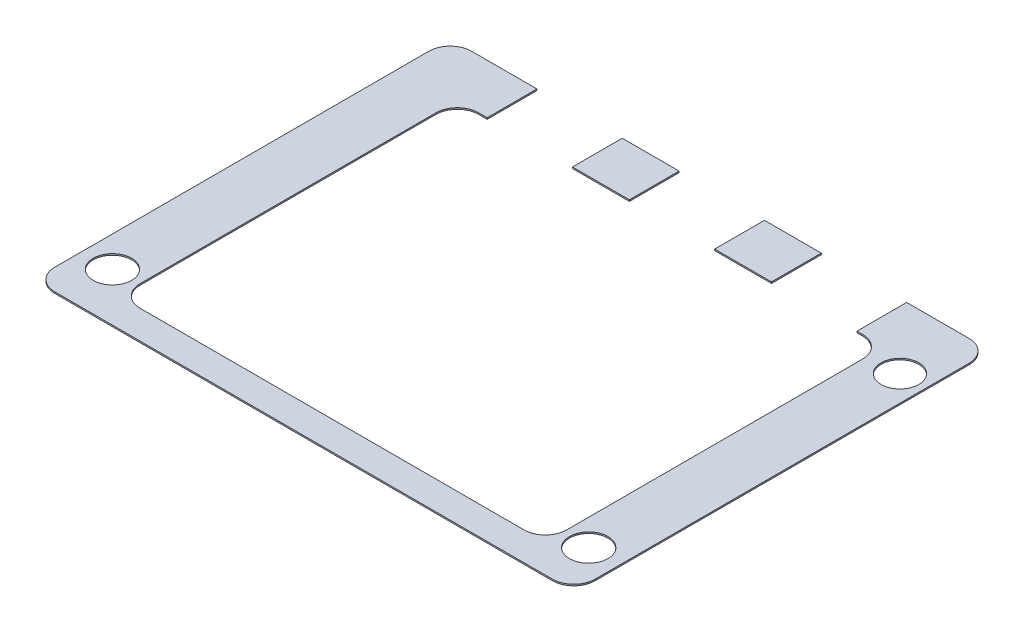
ISO-10303-21;
HEADER;
FILE_DESCRIPTION(('STEP AP214'),'2;1');
FILE_NAME('part.step','',(''),(''),'','','');
FILE_SCHEMA(('AUTOMOTIVE_DESIGN { 1 0 10303 214 1 1 1 1 }'));
ENDSEC;
DATA;
#1=APPLICATION_CONTEXT('core data for automotive mechanical design processes');
#2=APPLICATION_PROTOCOL_DEFINITION('international standard','automotive_design',2000,#1);
#3=PRODUCT_CONTEXT('',#1,'mechanical');
#4=PRODUCT('Part','Part','',(#3));
#5=PRODUCT_RELATED_PRODUCT_CATEGORY('part','',(#4));
#6=PRODUCT_DEFINITION_FORMATION('','',#4);
#7=PRODUCT_DEFINITION_CONTEXT('part definition',#1,'design');
#8=PRODUCT_DEFINITION('design','',#6,#7);
#9=PRODUCT_DEFINITION_SHAPE('','',#8);
#10=(LENGTH_UNIT() NAMED_UNIT(*) SI_UNIT(.MILLI.,.METRE.));
#11=(NAMED_UNIT(*) PLANE_ANGLE_UNIT() SI_UNIT($,.RADIAN.));
#12=(NAMED_UNIT(*) SI_UNIT($,.STERADIAN.) SOLID_ANGLE_UNIT());
#13=UNCERTAINTY_MEASURE_WITH_UNIT(LENGTH_MEASURE(1.E-05),#10,'distance_accuracy_value','');
#14=(GEOMETRIC_REPRESENTATION_CONTEXT(3) GLOBAL_UNCERTAINTY_ASSIGNED_CONTEXT((#13)) GLOBAL_UNIT_ASSIGNED_CONTEXT((#10,
#11,#12)) REPRESENTATION_CONTEXT('',''));
#15=CARTESIAN_POINT('',(0.,0.,0.));
#16=DIRECTION('',(0.,0.,1.));
#17=DIRECTION('',(1.,0.,0.));
#18=AXIS2_PLACEMENT_3D('',#15,#16,#17);
#19=CARTESIAN_POINT('',(2.99999999999992,0.2,-58.62));
#20=DIRECTION('',(0.,0.,1.));
#21=DIRECTION('',(1.,0.,0.));
#22=AXIS2_PLACEMENT_3D('',#19,#20,#21);
#23=PLANE('',#22);
#24=DIRECTION('',(-1.,0.,0.));
#25=VECTOR('',#24,1.);
#26=CARTESIAN_POINT('',(2.99999999999992,0.2,-58.62));
#27=LINE('',#26,#25);
#28=CARTESIAN_POINT('',(12.1999999999998,0.199999999999936,-58.6199999999999));
#29=VERTEX_POINT('',#28);
#30=CARTESIAN_POINT('',(2.99999999999972,0.2,-58.62));
#31=VERTEX_POINT('',#30);
#32=EDGE_CURVE('E263',#29,#31,#27,.T.);
#33=ORIENTED_EDGE('',*,*,#32,.F.);
#34=DIRECTION('',(0.,1.,0.));
#35=VECTOR('',#34,1.);
#36=CARTESIAN_POINT('',(12.1999999999998,0.199999999999936,-58.6199999999999));
#37=LINE('',#36,#35);
#38=CARTESIAN_POINT('',(12.1999999999998,0.,-58.6199999999999));
#39=VERTEX_POINT('',#38);
#40=EDGE_CURVE('E95',#39,#29,#37,.T.);
#41=ORIENTED_EDGE('',*,*,#40,.F.);
#42=DIRECTION('',(-1.,0.,0.));
#43=VECTOR('',#42,1.);
#44=CARTESIAN_POINT('',(2.99999999999992,0.,-58.62));
#45=LINE('',#44,#43);
#46=CARTESIAN_POINT('',(2.99999999999972,0.,-58.62));
#47=VERTEX_POINT('',#46);
#48=EDGE_CURVE('E260',#39,#47,#45,.T.);
#49=ORIENTED_EDGE('',*,*,#48,.T.);
#50=DIRECTION('',(0.,-1.,0.));
#51=VECTOR('',#50,1.);
#52=CARTESIAN_POINT('',(2.99999999999972,0.2,-58.62));
#53=LINE('',#52,#51);
#54=EDGE_CURVE('E364',#31,#47,#53,.T.);
#55=ORIENTED_EDGE('',*,*,#54,.F.);
#56=EDGE_LOOP('',(#33,#41,#49,#55));
#57=FACE_BOUND('',#56,.T.);
#58=ADVANCED_FACE('F50',(#57),#23,.F.);
#59=CARTESIAN_POINT('',(11.,0.2,-51.62));
#60=DIRECTION('',(0.,0.,1.));
#61=DIRECTION('',(1.,0.,0.));
#62=AXIS2_PLACEMENT_3D('',#59,#60,#61);
#63=PLANE('',#62);
#64=DIRECTION('',(0.,1.,0.));
#65=VECTOR('',#64,1.);
#66=CARTESIAN_POINT('',(12.1999999999997,0.199999999999936,-51.62));
#67=LINE('',#66,#65);
#68=CARTESIAN_POINT('',(12.1999999999997,0.,-51.62));
#69=VERTEX_POINT('',#68);
#70=CARTESIAN_POINT('',(12.1999999999997,0.2,-51.62));
#71=VERTEX_POINT('',#70);
#72=EDGE_CURVE('E86',#69,#71,#67,.T.);
#73=ORIENTED_EDGE('',*,*,#72,.T.);
#74=DIRECTION('',(-1.,0.,0.));
#75=VECTOR('',#74,1.);
#76=CARTESIAN_POINT('',(11.,0.2,-51.62));
#77=LINE('',#76,#75);
#78=CARTESIAN_POINT('',(11.,0.2,-51.62));
#79=VERTEX_POINT('',#78);
#80=EDGE_CURVE('E259',#71,#79,#77,.T.);
#81=ORIENTED_EDGE('',*,*,#80,.T.);
#82=DIRECTION('',(0.,-1.,0.));
#83=VECTOR('',#82,1.);
#84=CARTESIAN_POINT('',(11.,0.2,-51.62));
#85=LINE('',#84,#83);
#86=CARTESIAN_POINT('',(11.,0.,-51.62));
#87=VERTEX_POINT('',#86);
#88=EDGE_CURVE('E274',#79,#87,#85,.T.);
#89=ORIENTED_EDGE('',*,*,#88,.T.);
#90=DIRECTION('',(-1.,0.,0.));
#91=VECTOR('',#90,1.);
#92=CARTESIAN_POINT('',(11.,0.,-51.62));
#93=LINE('',#92,#91);
#94=EDGE_CURVE('E268',#69,#87,#93,.T.);
#95=ORIENTED_EDGE('',*,*,#94,.F.);
#96=EDGE_LOOP('',(#73,#81,#89,#95));
#97=FACE_BOUND('',#96,.T.);
#98=ADVANCED_FACE('F306',(#97),#63,.T.);
#99=CARTESIAN_POINT('',(72.9999999999998,0.2,-55.6199999999993));
#100=DIRECTION('',(0.,-1.,0.));
#101=DIRECTION('',(0.,0.,-1.));
#102=AXIS2_PLACEMENT_3D('',#99,#100,#101);
#103=PLANE('',#102);
#104=CARTESIAN_POINT('',(71.7,0.2,-6.4));
#105=DIRECTION('',(0.,-1.,0.));
#106=DIRECTION('',(0.,0.,-1.));
#107=AXIS2_PLACEMENT_3D('',#104,#105,#106);
#108=CIRCLE('',#107,2.7);
#109=CARTESIAN_POINT('',(71.7,0.2,-9.1));
#110=VERTEX_POINT('',#109);
#111=EDGE_CURVE('E635',#110,#110,#108,.T.);
#112=ORIENTED_EDGE('',*,*,#111,.T.);
#113=EDGE_LOOP('',(#112));
#114=FACE_BOUND('',#113,.T.);
#115=CARTESIAN_POINT('',(4.31063736549619,0.2,-6.80208357122959));
#116=DIRECTION('',(0.,-1.,0.));
#117=DIRECTION('',(0.,0.,-1.));
#118=AXIS2_PLACEMENT_3D('',#115,#116,#117);
#119=CIRCLE('',#118,2.7);
#120=CARTESIAN_POINT('',(4.31063736549619,0.2,-9.50208357122959));
#121=VERTEX_POINT('',#120);
#122=EDGE_CURVE('E358',#121,#121,#119,.T.);
#123=ORIENTED_EDGE('',*,*,#122,.T.);
#124=EDGE_LOOP('',(#123));
#125=FACE_BOUND('',#124,.T.);
#126=CARTESIAN_POINT('',(72.4022732832348,0.2,-49.4772805998877));
#127=DIRECTION('',(0.,-1.,0.));
#128=DIRECTION('',(0.,0.,-1.));
#129=AXIS2_PLACEMENT_3D('',#126,#127,#128);
#130=CIRCLE('',#129,2.65);
#131=CARTESIAN_POINT('',(72.4022732832348,0.2,-52.1272805998877));
#132=VERTEX_POINT('',#131);
#133=EDGE_CURVE('E348',#132,#132,#130,.T.);
#134=ORIENTED_EDGE('',*,*,#133,.T.);
#135=EDGE_LOOP('',(#134));
#136=FACE_BOUND('',#135,.T.);
#137=CARTESIAN_POINT('',(72.9999999999998,0.2,-58.6199999999995));
#138=VERTEX_POINT('',#137);
#139=CARTESIAN_POINT('',(64.1999999999998,0.199999999999936,-58.6199999999996));
#140=VERTEX_POINT('',#139);
#141=EDGE_CURVE('E264',#138,#140,#27,.T.);
#142=ORIENTED_EDGE('',*,*,#141,.T.);
#143=DIRECTION('',(0.,0.,-1.));
#144=VECTOR('',#143,1.);
#145=CARTESIAN_POINT('',(64.1999999999996,0.199999999999936,-39.6105763446639));
#146=LINE('',#145,#144);
#147=CARTESIAN_POINT('',(64.1999999999998,0.199999999999936,-51.62));
#148=VERTEX_POINT('',#147);
#149=EDGE_CURVE('E60',#148,#140,#146,.T.);
#150=ORIENTED_EDGE('',*,*,#149,.F.);
#151=CARTESIAN_POINT('',(65.,0.2,-51.62));
#152=VERTEX_POINT('',#151);
#153=EDGE_CURVE('E246',#152,#148,#77,.T.);
#154=ORIENTED_EDGE('',*,*,#153,.F.);
#155=CARTESIAN_POINT('',(65.,0.2,-48.62));
#156=DIRECTION('',(0.,1.,0.));
#157=DIRECTION('',(0.,0.,1.));
#158=AXIS2_PLACEMENT_3D('',#155,#156,#157);
#159=CIRCLE('',#158,3.);
#160=CARTESIAN_POINT('',(68.,0.2,-48.62));
#161=VERTEX_POINT('',#160);
#162=EDGE_CURVE('E247',#161,#152,#159,.T.);
#163=ORIENTED_EDGE('',*,*,#162,.F.);
#164=DIRECTION('',(0.,0.,-1.));
#165=VECTOR('',#164,1.);
#166=CARTESIAN_POINT('',(68.,0.2,-7.00000000000002));
#167=LINE('',#166,#165);
#168=CARTESIAN_POINT('',(68.,0.2,-7.00000000000002));
#169=VERTEX_POINT('',#168);
#170=EDGE_CURVE('E221',#169,#161,#167,.T.);
#171=ORIENTED_EDGE('',*,*,#170,.F.);
#172=CARTESIAN_POINT('',(65.,0.2,-7.));
#173=DIRECTION('',(0.,1.,0.));
#174=DIRECTION('',(0.,0.,1.));
#175=AXIS2_PLACEMENT_3D('',#172,#173,#174);
#176=CIRCLE('',#175,3.);
#177=CARTESIAN_POINT('',(65.,0.2,-4.));
#178=VERTEX_POINT('',#177);
#179=EDGE_CURVE('E218',#178,#169,#176,.T.);
#180=ORIENTED_EDGE('',*,*,#179,.F.);
#181=DIRECTION('',(1.,0.,0.));
#182=VECTOR('',#181,1.);
#183=CARTESIAN_POINT('',(11.,0.2,-4.));
#184=LINE('',#183,#182);
#185=CARTESIAN_POINT('',(11.,0.2,-4.));
#186=VERTEX_POINT('',#185);
#187=EDGE_CURVE('E137',#186,#178,#184,.T.);
#188=ORIENTED_EDGE('',*,*,#187,.F.);
#189=CARTESIAN_POINT('',(11.,0.2,-7.));
#190=DIRECTION('',(0.,1.,0.));
#191=DIRECTION('',(0.,0.,1.));
#192=AXIS2_PLACEMENT_3D('',#189,#190,#191);
#193=CIRCLE('',#192,3.);
#194=CARTESIAN_POINT('',(8.,0.2,-7.00000000000002));
#195=VERTEX_POINT('',#194);
#196=EDGE_CURVE('E147',#195,#186,#193,.T.);
#197=ORIENTED_EDGE('',*,*,#196,.F.);
#198=DIRECTION('',(0.,0.,1.));
#199=VECTOR('',#198,1.);
#200=CARTESIAN_POINT('',(8.,0.2,-7.00000000000002));
#201=LINE('',#200,#199);
#202=CARTESIAN_POINT('',(8.00000000000001,0.2,-48.62));
#203=VERTEX_POINT('',#202);
#204=EDGE_CURVE('E106',#203,#195,#201,.T.);
#205=ORIENTED_EDGE('',*,*,#204,.F.);
#206=CARTESIAN_POINT('',(11.,0.2,-48.62));
#207=DIRECTION('',(0.,1.,0.));
#208=DIRECTION('',(0.,0.,1.));
#209=AXIS2_PLACEMENT_3D('',#206,#207,#208);
#210=CIRCLE('',#209,3.);
#211=EDGE_CURVE('E243',#79,#203,#210,.T.);
#212=ORIENTED_EDGE('',*,*,#211,.F.);
#213=ORIENTED_EDGE('',*,*,#80,.F.);
#214=DIRECTION('',(0.,0.,-1.));
#215=VECTOR('',#214,1.);
#216=CARTESIAN_POINT('',(12.1999999999996,0.199999999999936,-39.6105763446643));
#217=LINE('',#216,#215);
#218=EDGE_CURVE('E261',#71,#29,#217,.T.);
#219=ORIENTED_EDGE('',*,*,#218,.T.);
#220=ORIENTED_EDGE('',*,*,#32,.T.);
#221=CARTESIAN_POINT('',(2.99999999999972,0.2,-55.6200000000001));
#222=DIRECTION('',(0.,1.,0.));
#223=DIRECTION('',(0.,0.,-1.));
#224=AXIS2_PLACEMENT_3D('',#221,#222,#223);
#225=CIRCLE('',#224,2.99999999999994);
#226=CARTESIAN_POINT('',(-2.22044604925031E-13,0.2,-55.6199999999998));
#227=VERTEX_POINT('',#226);
#228=EDGE_CURVE('E404',#31,#227,#225,.T.);
#229=ORIENTED_EDGE('',*,*,#228,.T.);
#230=DIRECTION('',(0.,0.,1.));
#231=VECTOR('',#230,1.);
#232=CARTESIAN_POINT('',(0.,0.2,-52.62));
#233=LINE('',#232,#231);
#234=CARTESIAN_POINT('',(0.,0.2,-3.00000000000002));
#235=VERTEX_POINT('',#234);
#236=EDGE_CURVE('E402',#227,#235,#233,.T.);
#237=ORIENTED_EDGE('',*,*,#236,.T.);
#238=CARTESIAN_POINT('',(3.,0.2,-3.));
#239=DIRECTION('',(0.,1.,0.));
#240=DIRECTION('',(0.,0.,1.));
#241=AXIS2_PLACEMENT_3D('',#238,#239,#240);
#242=CIRCLE('',#241,3.);
#243=CARTESIAN_POINT('',(3.00000000000002,0.2,0.));
#244=VERTEX_POINT('',#243);
#245=EDGE_CURVE('E400',#235,#244,#242,.T.);
#246=ORIENTED_EDGE('',*,*,#245,.T.);
#247=DIRECTION('',(1.,0.,0.));
#248=VECTOR('',#247,1.);
#249=CARTESIAN_POINT('',(3.00000000000002,0.2,0.));
#250=LINE('',#249,#248);
#251=CARTESIAN_POINT('',(73.,0.2,0.));
#252=VERTEX_POINT('',#251);
#253=EDGE_CURVE('E398',#244,#252,#250,.T.);
#254=ORIENTED_EDGE('',*,*,#253,.T.);
#255=CARTESIAN_POINT('',(73.,0.2,-3.));
#256=DIRECTION('',(0.,1.,0.));
#257=DIRECTION('',(0.,0.,1.));
#258=AXIS2_PLACEMENT_3D('',#255,#256,#257);
#259=CIRCLE('',#258,3.);
#260=CARTESIAN_POINT('',(76.,0.2,-3.00000000000002));
#261=VERTEX_POINT('',#260);
#262=EDGE_CURVE('E396',#252,#261,#259,.T.);
#263=ORIENTED_EDGE('',*,*,#262,.T.);
#264=DIRECTION('',(0.,0.,-1.));
#265=VECTOR('',#264,1.);
#266=CARTESIAN_POINT('',(76.,0.2,-3.00000000000002));
#267=LINE('',#266,#265);
#268=CARTESIAN_POINT('',(76.,0.2,-55.62));
#269=VERTEX_POINT('',#268);
#270=EDGE_CURVE('E394',#261,#269,#267,.T.);
#271=ORIENTED_EDGE('',*,*,#270,.T.);
#272=CARTESIAN_POINT('',(72.9999999999998,0.2,-55.6199999999993));
#273=DIRECTION('',(0.,1.,0.));
#274=DIRECTION('',(0.,0.,-1.));
#275=AXIS2_PLACEMENT_3D('',#272,#273,#274);
#276=CIRCLE('',#275,3.00000000000024);
#277=EDGE_CURVE('E269',#269,#138,#276,.T.);
#278=ORIENTED_EDGE('',*,*,#277,.T.);
#279=EDGE_LOOP('',(#142,#150,#154,#163,#171,#180,#188,#197,#205,#212,#213,#219,#220,#229,#237,
#246,#254,#263,#271,#278));
#280=FACE_BOUND('',#279,.T.);
#281=ADVANCED_FACE('F52',(#114,#125,#136,#280),#103,.F.);
#282=CARTESIAN_POINT('',(72.9999999999998,0.,-55.6199999999993));
#283=DIRECTION('',(0.,-1.,0.));
#284=DIRECTION('',(0.,0.,-1.));
#285=AXIS2_PLACEMENT_3D('',#282,#283,#284);
#286=PLANE('',#285);
#287=CARTESIAN_POINT('',(71.7,0.,-6.4));
#288=DIRECTION('',(0.,-1.,0.));
#289=DIRECTION('',(0.,0.,-1.));
#290=AXIS2_PLACEMENT_3D('',#287,#288,#289);
#291=CIRCLE('',#290,2.7);
#292=CARTESIAN_POINT('',(71.7,0.,-9.1));
#293=VERTEX_POINT('',#292);
#294=EDGE_CURVE('E640',#293,#293,#291,.T.);
#295=ORIENTED_EDGE('',*,*,#294,.F.);
#296=EDGE_LOOP('',(#295));
#297=FACE_BOUND('',#296,.T.);
#298=CARTESIAN_POINT('',(4.31063736549619,0.,-6.80208357122959));
#299=DIRECTION('',(0.,-1.,0.));
#300=DIRECTION('',(0.,0.,-1.));
#301=AXIS2_PLACEMENT_3D('',#298,#299,#300);
#302=CIRCLE('',#301,2.7);
#303=CARTESIAN_POINT('',(4.31063736549619,0.,-9.50208357122959));
#304=VERTEX_POINT('',#303);
#305=EDGE_CURVE('E361',#304,#304,#302,.T.);
#306=ORIENTED_EDGE('',*,*,#305,.F.);
#307=EDGE_LOOP('',(#306));
#308=FACE_BOUND('',#307,.T.);
#309=CARTESIAN_POINT('',(72.4022732832348,0.,-49.4772805998877));
#310=DIRECTION('',(0.,-1.,0.));
#311=DIRECTION('',(0.,0.,-1.));
#312=AXIS2_PLACEMENT_3D('',#309,#310,#311);
#313=CIRCLE('',#312,2.65);
#314=CARTESIAN_POINT('',(72.4022732832348,0.,-52.1272805998877));
#315=VERTEX_POINT('',#314);
#316=EDGE_CURVE('E353',#315,#315,#313,.T.);
#317=ORIENTED_EDGE('',*,*,#316,.F.);
#318=EDGE_LOOP('',(#317));
#319=FACE_BOUND('',#318,.T.);
#320=DIRECTION('',(0.,0.,-1.));
#321=VECTOR('',#320,1.);
#322=CARTESIAN_POINT('',(64.1999999999996,0.,-39.6105763446639));
#323=LINE('',#322,#321);
#324=CARTESIAN_POINT('',(64.1999999999997,0.,-51.62));
#325=VERTEX_POINT('',#324);
#326=CARTESIAN_POINT('',(64.1999999999998,0.,-58.6199999999996));
#327=VERTEX_POINT('',#326);
#328=EDGE_CURVE('E266',#325,#327,#323,.T.);
#329=ORIENTED_EDGE('',*,*,#328,.T.);
#330=CARTESIAN_POINT('',(72.9999999999998,0.,-58.6199999999995));
#331=VERTEX_POINT('',#330);
#332=EDGE_CURVE('E54',#331,#327,#45,.T.);
#333=ORIENTED_EDGE('',*,*,#332,.F.);
#334=CARTESIAN_POINT('',(72.9999999999998,0.,-55.6199999999993));
#335=DIRECTION('',(0.,1.,0.));
#336=DIRECTION('',(0.,0.,-1.));
#337=AXIS2_PLACEMENT_3D('',#334,#335,#336);
#338=CIRCLE('',#337,3.00000000000024);
#339=CARTESIAN_POINT('',(76.,0.,-55.62));
#340=VERTEX_POINT('',#339);
#341=EDGE_CURVE('E277',#340,#331,#338,.T.);
#342=ORIENTED_EDGE('',*,*,#341,.F.);
#343=DIRECTION('',(0.,0.,-1.));
#344=VECTOR('',#343,1.);
#345=CARTESIAN_POINT('',(76.,0.,-55.62));
#346=LINE('',#345,#344);
#347=CARTESIAN_POINT('',(76.,0.,-3.00000000000002));
#348=VERTEX_POINT('',#347);
#349=EDGE_CURVE('E382',#348,#340,#346,.T.);
#350=ORIENTED_EDGE('',*,*,#349,.F.);
#351=CARTESIAN_POINT('',(73.,0.,-3.));
#352=DIRECTION('',(0.,1.,0.));
#353=DIRECTION('',(0.,0.,1.));
#354=AXIS2_PLACEMENT_3D('',#351,#352,#353);
#355=CIRCLE('',#354,3.);
#356=CARTESIAN_POINT('',(73.,0.,0.));
#357=VERTEX_POINT('',#356);
#358=EDGE_CURVE('E378',#357,#348,#355,.T.);
#359=ORIENTED_EDGE('',*,*,#358,.F.);
#360=DIRECTION('',(1.,0.,0.));
#361=VECTOR('',#360,1.);
#362=CARTESIAN_POINT('',(3.00000000000002,0.,0.));
#363=LINE('',#362,#361);
#364=CARTESIAN_POINT('',(3.00000000000002,0.,0.));
#365=VERTEX_POINT('',#364);
#366=EDGE_CURVE('E374',#365,#357,#363,.T.);
#367=ORIENTED_EDGE('',*,*,#366,.F.);
#368=CARTESIAN_POINT('',(3.,0.,-3.));
#369=DIRECTION('',(0.,1.,0.));
#370=DIRECTION('',(0.,0.,1.));
#371=AXIS2_PLACEMENT_3D('',#368,#369,#370);
#372=CIRCLE('',#371,3.);
#373=CARTESIAN_POINT('',(0.,0.,-3.00000000000002));
#374=VERTEX_POINT('',#373);
#375=EDGE_CURVE('E370',#374,#365,#372,.T.);
#376=ORIENTED_EDGE('',*,*,#375,.F.);
#377=DIRECTION('',(0.,0.,1.));
#378=VECTOR('',#377,1.);
#379=CARTESIAN_POINT('',(0.,0.,-3.00000000000002));
#380=LINE('',#379,#378);
#381=CARTESIAN_POINT('',(-2.22044604925031E-13,0.,-55.6199999999998));
#382=VERTEX_POINT('',#381);
#383=EDGE_CURVE('E366',#382,#374,#380,.T.);
#384=ORIENTED_EDGE('',*,*,#383,.F.);
#385=CARTESIAN_POINT('',(2.99999999999972,0.,-55.6200000000001));
#386=DIRECTION('',(0.,1.,0.));
#387=DIRECTION('',(0.,0.,-1.));
#388=AXIS2_PLACEMENT_3D('',#385,#386,#387);
#389=CIRCLE('',#388,2.99999999999994);
#390=EDGE_CURVE('E344',#47,#382,#389,.T.);
#391=ORIENTED_EDGE('',*,*,#390,.F.);
#392=ORIENTED_EDGE('',*,*,#48,.F.);
#393=DIRECTION('',(0.,0.,-1.));
#394=VECTOR('',#393,1.);
#395=CARTESIAN_POINT('',(12.1999999999996,0.,-39.6105763446643));
#396=LINE('',#395,#394);
#397=EDGE_CURVE('E98',#69,#39,#396,.T.);
#398=ORIENTED_EDGE('',*,*,#397,.F.);
#399=ORIENTED_EDGE('',*,*,#94,.T.);
#400=CARTESIAN_POINT('',(11.,0.,-48.62));
#401=DIRECTION('',(0.,1.,0.));
#402=DIRECTION('',(0.,0.,1.));
#403=AXIS2_PLACEMENT_3D('',#400,#401,#402);
#404=CIRCLE('',#403,3.);
#405=CARTESIAN_POINT('',(8.,0.,-48.62));
#406=VERTEX_POINT('',#405);
#407=EDGE_CURVE('E296',#87,#406,#404,.T.);
#408=ORIENTED_EDGE('',*,*,#407,.T.);
#409=DIRECTION('',(0.,0.,1.));
#410=VECTOR('',#409,1.);
#411=CARTESIAN_POINT('',(8.,0.,-7.00000000000002));
#412=LINE('',#411,#410);
#413=CARTESIAN_POINT('',(8.00000000000001,0.,-7.00000000000002));
#414=VERTEX_POINT('',#413);
#415=EDGE_CURVE('E239',#406,#414,#412,.T.);
#416=ORIENTED_EDGE('',*,*,#415,.T.);
#417=CARTESIAN_POINT('',(11.,0.,-7.));
#418=DIRECTION('',(0.,1.,0.));
#419=DIRECTION('',(0.,0.,1.));
#420=AXIS2_PLACEMENT_3D('',#417,#418,#419);
#421=CIRCLE('',#420,3.);
#422=CARTESIAN_POINT('',(11.,0.,-4.));
#423=VERTEX_POINT('',#422);
#424=EDGE_CURVE('E152',#414,#423,#421,.T.);
#425=ORIENTED_EDGE('',*,*,#424,.T.);
#426=DIRECTION('',(1.,0.,0.));
#427=VECTOR('',#426,1.);
#428=CARTESIAN_POINT('',(11.,0.,-4.));
#429=LINE('',#428,#427);
#430=CARTESIAN_POINT('',(65.,0.,-4.));
#431=VERTEX_POINT('',#430);
#432=EDGE_CURVE('E141',#423,#431,#429,.T.);
#433=ORIENTED_EDGE('',*,*,#432,.T.);
#434=CARTESIAN_POINT('',(65.,0.,-7.));
#435=DIRECTION('',(0.,1.,0.));
#436=DIRECTION('',(0.,0.,1.));
#437=AXIS2_PLACEMENT_3D('',#434,#435,#436);
#438=CIRCLE('',#437,3.);
#439=CARTESIAN_POINT('',(68.,0.,-7.00000000000002));
#440=VERTEX_POINT('',#439);
#441=EDGE_CURVE('E216',#431,#440,#438,.T.);
#442=ORIENTED_EDGE('',*,*,#441,.T.);
#443=DIRECTION('',(0.,0.,-1.));
#444=VECTOR('',#443,1.);
#445=CARTESIAN_POINT('',(68.,0.,-7.00000000000002));
#446=LINE('',#445,#444);
#447=CARTESIAN_POINT('',(68.,0.,-48.62));
#448=VERTEX_POINT('',#447);
#449=EDGE_CURVE('E224',#440,#448,#446,.T.);
#450=ORIENTED_EDGE('',*,*,#449,.T.);
#451=CARTESIAN_POINT('',(65.,0.,-48.62));
#452=DIRECTION('',(0.,1.,0.));
#453=DIRECTION('',(0.,0.,1.));
#454=AXIS2_PLACEMENT_3D('',#451,#452,#453);
#455=CIRCLE('',#454,3.);
#456=CARTESIAN_POINT('',(65.,0.,-51.62));
#457=VERTEX_POINT('',#456);
#458=EDGE_CURVE('E231',#448,#457,#455,.T.);
#459=ORIENTED_EDGE('',*,*,#458,.T.);
#460=EDGE_CURVE('E275',#457,#325,#93,.T.);
#461=ORIENTED_EDGE('',*,*,#460,.T.);
#462=EDGE_LOOP('',(#329,#333,#342,#350,#359,#367,#376,#384,#391,#392,#398,#399,#408,#416,#425,
#433,#442,#450,#459,#461));
#463=FACE_BOUND('',#462,.T.);
#464=ADVANCED_FACE('F233',(#297,#308,#319,#463),#286,.T.);
#465=CARTESIAN_POINT('',(72.9999999999998,0.2,-55.6199999999993));
#466=DIRECTION('',(0.,-1.,0.));
#467=DIRECTION('',(0.,0.,-1.));
#468=AXIS2_PLACEMENT_3D('',#465,#466,#467);
#469=CYLINDRICAL_SURFACE('',#468,3.00000000000024);
#470=ORIENTED_EDGE('',*,*,#341,.T.);
#471=DIRECTION('',(0.,-1.,0.));
#472=VECTOR('',#471,1.);
#473=CARTESIAN_POINT('',(72.9999999999998,0.2,-58.6199999999995));
#474=LINE('',#473,#472);
#475=EDGE_CURVE('E340',#138,#331,#474,.T.);
#476=ORIENTED_EDGE('',*,*,#475,.F.);
#477=ORIENTED_EDGE('',*,*,#277,.F.);
#478=DIRECTION('',(0.,-1.,0.));
#479=VECTOR('',#478,1.);
#480=CARTESIAN_POINT('',(76.,0.2,-55.62));
#481=LINE('',#480,#479);
#482=EDGE_CURVE('E343',#269,#340,#481,.T.);
#483=ORIENTED_EDGE('',*,*,#482,.T.);
#484=EDGE_LOOP('',(#470,#476,#477,#483));
#485=FACE_BOUND('',#484,.T.);
#486=ADVANCED_FACE('F326',(#485),#469,.T.);
#487=ORIENTED_EDGE('',*,*,#332,.T.);
#488=DIRECTION('',(0.,-1.,0.));
#489=VECTOR('',#488,1.);
#490=CARTESIAN_POINT('',(64.1999999999998,0.199999999999936,-58.6199999999996));
#491=LINE('',#490,#489);
#492=EDGE_CURVE('E12',#140,#327,#491,.T.);
#493=ORIENTED_EDGE('',*,*,#492,.F.);
#494=ORIENTED_EDGE('',*,*,#141,.F.);
#495=ORIENTED_EDGE('',*,*,#475,.T.);
#496=EDGE_LOOP('',(#487,#493,#494,#495));
#497=FACE_BOUND('',#496,.T.);
#498=ADVANCED_FACE('F319',(#497),#23,.F.);
#499=CARTESIAN_POINT('',(2.99999999999972,0.2,-55.6200000000001));
#500=DIRECTION('',(0.,-1.,0.));
#501=DIRECTION('',(0.,0.,-1.));
#502=AXIS2_PLACEMENT_3D('',#499,#500,#501);
#503=CYLINDRICAL_SURFACE('',#502,2.99999999999994);
#504=ORIENTED_EDGE('',*,*,#390,.T.);
#505=DIRECTION('',(0.,-1.,0.));
#506=VECTOR('',#505,1.);
#507=CARTESIAN_POINT('',(-2.22044604925031E-13,0.2,-55.6199999999998));
#508=LINE('',#507,#506);
#509=EDGE_CURVE('E367',#227,#382,#508,.T.);
#510=ORIENTED_EDGE('',*,*,#509,.F.);
#511=ORIENTED_EDGE('',*,*,#228,.F.);
#512=ORIENTED_EDGE('',*,*,#54,.T.);
#513=EDGE_LOOP('',(#504,#510,#511,#512));
#514=FACE_BOUND('',#513,.T.);
#515=ADVANCED_FACE('F325',(#514),#503,.T.);
#516=CARTESIAN_POINT('',(0.,0.2,-3.00000000000002));
#517=DIRECTION('',(1.,0.,0.));
#518=DIRECTION('',(0.,0.,-1.));
#519=AXIS2_PLACEMENT_3D('',#516,#517,#518);
#520=PLANE('',#519);
#521=ORIENTED_EDGE('',*,*,#383,.T.);
#522=DIRECTION('',(0.,-1.,0.));
#523=VECTOR('',#522,1.);
#524=CARTESIAN_POINT('',(0.,0.2,-3.00000000000002));
#525=LINE('',#524,#523);
#526=EDGE_CURVE('E371',#235,#374,#525,.T.);
#527=ORIENTED_EDGE('',*,*,#526,.F.);
#528=ORIENTED_EDGE('',*,*,#236,.F.);
#529=ORIENTED_EDGE('',*,*,#509,.T.);
#530=EDGE_LOOP('',(#521,#527,#528,#529));
#531=FACE_BOUND('',#530,.T.);
#532=ADVANCED_FACE('F332',(#531),#520,.F.);
#533=CARTESIAN_POINT('',(3.,0.2,-3.));
#534=DIRECTION('',(0.,-1.,0.));
#535=DIRECTION('',(0.,0.,-1.));
#536=AXIS2_PLACEMENT_3D('',#533,#534,#535);
#537=CYLINDRICAL_SURFACE('',#536,3.);
#538=ORIENTED_EDGE('',*,*,#375,.T.);
#539=DIRECTION('',(0.,-1.,0.));
#540=VECTOR('',#539,1.);
#541=CARTESIAN_POINT('',(3.00000000000002,0.2,0.));
#542=LINE('',#541,#540);
#543=EDGE_CURVE('E375',#244,#365,#542,.T.);
#544=ORIENTED_EDGE('',*,*,#543,.F.);
#545=ORIENTED_EDGE('',*,*,#245,.F.);
#546=ORIENTED_EDGE('',*,*,#526,.T.);
#547=EDGE_LOOP('',(#538,#544,#545,#546));
#548=FACE_BOUND('',#547,.T.);
#549=ADVANCED_FACE('F465',(#548),#537,.T.);
#550=CARTESIAN_POINT('',(3.00000000000002,0.2,0.));
#551=DIRECTION('',(0.,0.,-1.));
#552=DIRECTION('',(-1.,0.,0.));
#553=AXIS2_PLACEMENT_3D('',#550,#551,#552);
#554=PLANE('',#553);
#555=ORIENTED_EDGE('',*,*,#366,.T.);
#556=DIRECTION('',(0.,-1.,0.));
#557=VECTOR('',#556,1.);
#558=CARTESIAN_POINT('',(73.,0.2,0.));
#559=LINE('',#558,#557);
#560=EDGE_CURVE('E379',#252,#357,#559,.T.);
#561=ORIENTED_EDGE('',*,*,#560,.F.);
#562=ORIENTED_EDGE('',*,*,#253,.F.);
#563=ORIENTED_EDGE('',*,*,#543,.T.);
#564=EDGE_LOOP('',(#555,#561,#562,#563));
#565=FACE_BOUND('',#564,.T.);
#566=ADVANCED_FACE('F431',(#565),#554,.F.);
#567=CARTESIAN_POINT('',(73.,0.2,-3.));
#568=DIRECTION('',(0.,-1.,0.));
#569=DIRECTION('',(0.,0.,-1.));
#570=AXIS2_PLACEMENT_3D('',#567,#568,#569);
#571=CYLINDRICAL_SURFACE('',#570,3.);
#572=ORIENTED_EDGE('',*,*,#358,.T.);
#573=DIRECTION('',(0.,-1.,0.));
#574=VECTOR('',#573,1.);
#575=CARTESIAN_POINT('',(76.,0.2,-3.00000000000002));
#576=LINE('',#575,#574);
#577=EDGE_CURVE('E256',#261,#348,#576,.T.);
#578=ORIENTED_EDGE('',*,*,#577,.F.);
#579=ORIENTED_EDGE('',*,*,#262,.F.);
#580=ORIENTED_EDGE('',*,*,#560,.T.);
#581=EDGE_LOOP('',(#572,#578,#579,#580));
#582=FACE_BOUND('',#581,.T.);
#583=ADVANCED_FACE('F419',(#582),#571,.T.);
#584=CARTESIAN_POINT('',(76.,0.2,-55.62));
#585=DIRECTION('',(-1.,0.,0.));
#586=DIRECTION('',(0.,0.,1.));
#587=AXIS2_PLACEMENT_3D('',#584,#585,#586);
#588=PLANE('',#587);
#589=ORIENTED_EDGE('',*,*,#349,.T.);
#590=ORIENTED_EDGE('',*,*,#482,.F.);
#591=ORIENTED_EDGE('',*,*,#270,.F.);
#592=ORIENTED_EDGE('',*,*,#577,.T.);
#593=EDGE_LOOP('',(#589,#590,#591,#592));
#594=FACE_BOUND('',#593,.T.);
#595=ADVANCED_FACE('F422',(#594),#588,.F.);
#596=CARTESIAN_POINT('',(11.,0.2,-7.));
#597=DIRECTION('',(0.,-1.,0.));
#598=DIRECTION('',(0.,0.,-1.));
#599=AXIS2_PLACEMENT_3D('',#596,#597,#598);
#600=CYLINDRICAL_SURFACE('',#599,3.);
#601=ORIENTED_EDGE('',*,*,#424,.F.);
#602=DIRECTION('',(0.,-1.,0.));
#603=VECTOR('',#602,1.);
#604=CARTESIAN_POINT('',(8.,0.2,-7.00000000000002));
#605=LINE('',#604,#603);
#606=EDGE_CURVE('E241',#195,#414,#605,.T.);
#607=ORIENTED_EDGE('',*,*,#606,.F.);
#608=ORIENTED_EDGE('',*,*,#196,.T.);
#609=DIRECTION('',(0.,-1.,0.));
#610=VECTOR('',#609,1.);
#611=CARTESIAN_POINT('',(11.,0.2,-4.));
#612=LINE('',#611,#610);
#613=EDGE_CURVE('E254',#186,#423,#612,.T.);
#614=ORIENTED_EDGE('',*,*,#613,.T.);
#615=EDGE_LOOP('',(#601,#607,#608,#614));
#616=FACE_BOUND('',#615,.T.);
#617=ADVANCED_FACE('F424',(#616),#600,.F.);
#618=CARTESIAN_POINT('',(11.,0.2,-4.));
#619=DIRECTION('',(0.,0.,-1.));
#620=DIRECTION('',(-1.,0.,0.));
#621=AXIS2_PLACEMENT_3D('',#618,#619,#620);
#622=PLANE('',#621);
#623=ORIENTED_EDGE('',*,*,#432,.F.);
#624=ORIENTED_EDGE('',*,*,#613,.F.);
#625=ORIENTED_EDGE('',*,*,#187,.T.);
#626=DIRECTION('',(0.,-1.,0.));
#627=VECTOR('',#626,1.);
#628=CARTESIAN_POINT('',(65.,0.2,-4.));
#629=LINE('',#628,#627);
#630=EDGE_CURVE('E252',#178,#431,#629,.T.);
#631=ORIENTED_EDGE('',*,*,#630,.T.);
#632=EDGE_LOOP('',(#623,#624,#625,#631));
#633=FACE_BOUND('',#632,.T.);
#634=ADVANCED_FACE('F409',(#633),#622,.T.);
#635=CARTESIAN_POINT('',(65.,0.2,-7.));
#636=DIRECTION('',(0.,-1.,0.));
#637=DIRECTION('',(0.,0.,-1.));
#638=AXIS2_PLACEMENT_3D('',#635,#636,#637);
#639=CYLINDRICAL_SURFACE('',#638,3.);
#640=ORIENTED_EDGE('',*,*,#441,.F.);
#641=ORIENTED_EDGE('',*,*,#630,.F.);
#642=ORIENTED_EDGE('',*,*,#179,.T.);
#643=DIRECTION('',(0.,-1.,0.));
#644=VECTOR('',#643,1.);
#645=CARTESIAN_POINT('',(68.,0.2,-7.00000000000002));
#646=LINE('',#645,#644);
#647=EDGE_CURVE('E212',#169,#440,#646,.T.);
#648=ORIENTED_EDGE('',*,*,#647,.T.);
#649=EDGE_LOOP('',(#640,#641,#642,#648));
#650=FACE_BOUND('',#649,.T.);
#651=ADVANCED_FACE('F214',(#650),#639,.F.);
#652=CARTESIAN_POINT('',(68.,0.2,-7.00000000000002));
#653=DIRECTION('',(-1.,0.,0.));
#654=DIRECTION('',(0.,0.,1.));
#655=AXIS2_PLACEMENT_3D('',#652,#653,#654);
#656=PLANE('',#655);
#657=ORIENTED_EDGE('',*,*,#449,.F.);
#658=ORIENTED_EDGE('',*,*,#647,.F.);
#659=ORIENTED_EDGE('',*,*,#170,.T.);
#660=DIRECTION('',(0.,-1.,0.));
#661=VECTOR('',#660,1.);
#662=CARTESIAN_POINT('',(68.,0.2,-48.62));
#663=LINE('',#662,#661);
#664=EDGE_CURVE('E227',#161,#448,#663,.T.);
#665=ORIENTED_EDGE('',*,*,#664,.T.);
#666=EDGE_LOOP('',(#657,#658,#659,#665));
#667=FACE_BOUND('',#666,.T.);
#668=ADVANCED_FACE('F225',(#667),#656,.T.);
#669=CARTESIAN_POINT('',(65.,0.2,-48.62));
#670=DIRECTION('',(0.,-1.,0.));
#671=DIRECTION('',(0.,0.,-1.));
#672=AXIS2_PLACEMENT_3D('',#669,#670,#671);
#673=CYLINDRICAL_SURFACE('',#672,3.);
#674=ORIENTED_EDGE('',*,*,#458,.F.);
#675=ORIENTED_EDGE('',*,*,#664,.F.);
#676=ORIENTED_EDGE('',*,*,#162,.T.);
#677=DIRECTION('',(0.,-1.,0.));
#678=VECTOR('',#677,1.);
#679=CARTESIAN_POINT('',(65.,0.2,-51.62));
#680=LINE('',#679,#678);
#681=EDGE_CURVE('E249',#152,#457,#680,.T.);
#682=ORIENTED_EDGE('',*,*,#681,.T.);
#683=EDGE_LOOP('',(#674,#675,#676,#682));
#684=FACE_BOUND('',#683,.T.);
#685=ADVANCED_FACE('F300',(#684),#673,.F.);
#686=DIRECTION('',(0.,-1.,0.));
#687=VECTOR('',#686,1.);
#688=CARTESIAN_POINT('',(64.1999999999997,0.199999999999936,-51.62));
#689=LINE('',#688,#687);
#690=EDGE_CURVE('E69',#148,#325,#689,.T.);
#691=ORIENTED_EDGE('',*,*,#690,.T.);
#692=ORIENTED_EDGE('',*,*,#460,.F.);
#693=ORIENTED_EDGE('',*,*,#681,.F.);
#694=ORIENTED_EDGE('',*,*,#153,.T.);
#695=EDGE_LOOP('',(#691,#692,#693,#694));
#696=FACE_BOUND('',#695,.T.);
#697=ADVANCED_FACE('F302',(#696),#63,.T.);
#698=CARTESIAN_POINT('',(11.,0.2,-48.62));
#699=DIRECTION('',(0.,-1.,0.));
#700=DIRECTION('',(0.,0.,-1.));
#701=AXIS2_PLACEMENT_3D('',#698,#699,#700);
#702=CYLINDRICAL_SURFACE('',#701,3.);
#703=ORIENTED_EDGE('',*,*,#407,.F.);
#704=ORIENTED_EDGE('',*,*,#88,.F.);
#705=ORIENTED_EDGE('',*,*,#211,.T.);
#706=DIRECTION('',(0.,-1.,0.));
#707=VECTOR('',#706,1.);
#708=CARTESIAN_POINT('',(8.,0.2,-48.62));
#709=LINE('',#708,#707);
#710=EDGE_CURVE('E242',#203,#406,#709,.T.);
#711=ORIENTED_EDGE('',*,*,#710,.T.);
#712=EDGE_LOOP('',(#703,#704,#705,#711));
#713=FACE_BOUND('',#712,.T.);
#714=ADVANCED_FACE('F304',(#713),#702,.F.);
#715=CARTESIAN_POINT('',(8.,0.2,-7.00000000000002));
#716=DIRECTION('',(1.,0.,0.));
#717=DIRECTION('',(0.,0.,-1.));
#718=AXIS2_PLACEMENT_3D('',#715,#716,#717);
#719=PLANE('',#718);
#720=ORIENTED_EDGE('',*,*,#415,.F.);
#721=ORIENTED_EDGE('',*,*,#710,.F.);
#722=ORIENTED_EDGE('',*,*,#204,.T.);
#723=ORIENTED_EDGE('',*,*,#606,.T.);
#724=EDGE_LOOP('',(#720,#721,#722,#723));
#725=FACE_BOUND('',#724,.T.);
#726=ADVANCED_FACE('F311',(#725),#719,.T.);
#727=CARTESIAN_POINT('',(12.1999999999996,0.199999999999936,-39.6105763446643));
#728=DIRECTION('',(-1.,0.,0.));
#729=DIRECTION('',(0.,0.,1.));
#730=AXIS2_PLACEMENT_3D('',#727,#728,#729);
#731=PLANE('',#730);
#732=ORIENTED_EDGE('',*,*,#397,.T.);
#733=ORIENTED_EDGE('',*,*,#40,.T.);
#734=ORIENTED_EDGE('',*,*,#218,.F.);
#735=ORIENTED_EDGE('',*,*,#72,.F.);
#736=EDGE_LOOP('',(#732,#733,#734,#735));
#737=FACE_BOUND('',#736,.T.);
#738=ADVANCED_FACE('F443',(#737),#731,.F.);
#739=CARTESIAN_POINT('',(64.1999999999996,0.199999999999936,-39.6105763446639));
#740=DIRECTION('',(1.,0.,0.));
#741=DIRECTION('',(0.,0.,-1.));
#742=AXIS2_PLACEMENT_3D('',#739,#740,#741);
#743=PLANE('',#742);
#744=ORIENTED_EDGE('',*,*,#149,.T.);
#745=ORIENTED_EDGE('',*,*,#492,.T.);
#746=ORIENTED_EDGE('',*,*,#328,.F.);
#747=ORIENTED_EDGE('',*,*,#690,.F.);
#748=EDGE_LOOP('',(#744,#745,#746,#747));
#749=FACE_BOUND('',#748,.T.);
#750=ADVANCED_FACE('F445',(#749),#743,.F.);
#751=CARTESIAN_POINT('',(72.4022732832348,0.2,-49.4772805998877));
#752=DIRECTION('',(0.,-1.,0.));
#753=DIRECTION('',(0.,0.,-1.));
#754=AXIS2_PLACEMENT_3D('',#751,#752,#753);
#755=CYLINDRICAL_SURFACE('',#754,2.65);
#756=ORIENTED_EDGE('',*,*,#133,.F.);
#757=EDGE_LOOP('',(#756));
#758=FACE_BOUND('',#757,.T.);
#759=ORIENTED_EDGE('',*,*,#316,.T.);
#760=EDGE_LOOP('',(#759));
#761=FACE_BOUND('',#760,.T.);
#762=ADVANCED_FACE('F447',(#758,#761),#755,.F.);
#763=CARTESIAN_POINT('',(4.31063736549619,0.2,-6.80208357122959));
#764=DIRECTION('',(0.,-1.,0.));
#765=DIRECTION('',(0.,0.,-1.));
#766=AXIS2_PLACEMENT_3D('',#763,#764,#765);
#767=CYLINDRICAL_SURFACE('',#766,2.7);
#768=ORIENTED_EDGE('',*,*,#122,.F.);
#769=EDGE_LOOP('',(#768));
#770=FACE_BOUND('',#769,.T.);
#771=ORIENTED_EDGE('',*,*,#305,.T.);
#772=EDGE_LOOP('',(#771));
#773=FACE_BOUND('',#772,.T.);
#774=ADVANCED_FACE('F451',(#770,#773),#767,.F.);
#775=CARTESIAN_POINT('',(71.7,0.2,-6.4));
#776=DIRECTION('',(0.,-1.,0.));
#777=DIRECTION('',(0.,0.,-1.));
#778=AXIS2_PLACEMENT_3D('',#775,#776,#777);
#779=CYLINDRICAL_SURFACE('',#778,2.7);
#780=ORIENTED_EDGE('',*,*,#111,.F.);
#781=EDGE_LOOP('',(#780));
#782=FACE_BOUND('',#781,.T.);
#783=ORIENTED_EDGE('',*,*,#294,.T.);
#784=EDGE_LOOP('',(#783));
#785=FACE_BOUND('',#784,.T.);
#786=ADVANCED_FACE('F457',(#782,#785),#779,.F.);
#787=CLOSED_SHELL('',(#58,#98,#281,#464,#486,#498,#515,#532,#549,#566,#583,#595,#617,#634,#651,
#668,#685,#697,#714,#726,#738,#750,#762,#774,#786));
#788=MANIFOLD_SOLID_BREP('B2',#787);
#789=CARTESIAN_POINT('',(2.99999999999992,0.2,-58.62));
#790=DIRECTION('',(0.,0.,1.));
#791=DIRECTION('',(1.,0.,0.));
#792=AXIS2_PLACEMENT_3D('',#789,#790,#791);
#793=PLANE('',#792);
#794=DIRECTION('',(-1.,0.,0.));
#795=VECTOR('',#794,1.);
#796=CARTESIAN_POINT('',(2.99999999999992,0.2,-58.62));
#797=LINE('',#796,#795);
#798=CARTESIAN_POINT('',(32.1984040644276,0.199999999999936,-58.6199999999998));
#799=VERTEX_POINT('',#798);
#800=CARTESIAN_POINT('',(24.1999999999998,0.199999999999936,-58.6199999999999));
#801=VERTEX_POINT('',#800);
#802=EDGE_CURVE('E713',#799,#801,#797,.T.);
#803=ORIENTED_EDGE('',*,*,#802,.F.);
#804=DIRECTION('',(0.,1.,0.));
#805=VECTOR('',#804,1.);
#806=CARTESIAN_POINT('',(32.1984040644276,0.199999999999936,-58.6199999999998));
#807=LINE('',#806,#805);
#808=CARTESIAN_POINT('',(32.1984040644276,0.,-58.6199999999998));
#809=VERTEX_POINT('',#808);
#810=EDGE_CURVE('E48',#809,#799,#807,.T.);
#811=ORIENTED_EDGE('',*,*,#810,.F.);
#812=DIRECTION('',(-1.,0.,0.));
#813=VECTOR('',#812,1.);
#814=CARTESIAN_POINT('',(2.99999999999992,0.,-58.62));
#815=LINE('',#814,#813);
#816=CARTESIAN_POINT('',(24.1999999999998,0.,-58.6199999999999));
#817=VERTEX_POINT('',#816);
#818=EDGE_CURVE('E666',#809,#817,#815,.T.);
#819=ORIENTED_EDGE('',*,*,#818,.T.);
#820=DIRECTION('',(0.,-1.,0.));
#821=VECTOR('',#820,1.);
#822=CARTESIAN_POINT('',(24.1999999999998,0.199999999999936,-58.6199999999999));
#823=LINE('',#822,#821);
#824=EDGE_CURVE('E708',#801,#817,#823,.T.);
#825=ORIENTED_EDGE('',*,*,#824,.F.);
#826=EDGE_LOOP('',(#803,#811,#819,#825));
#827=FACE_BOUND('',#826,.T.);
#828=ADVANCED_FACE('F662',(#827),#793,.F.);
#829=CARTESIAN_POINT('',(11.,0.2,-51.62));
#830=DIRECTION('',(0.,0.,1.));
#831=DIRECTION('',(1.,0.,0.));
#832=AXIS2_PLACEMENT_3D('',#829,#830,#831);
#833=PLANE('',#832);
#834=DIRECTION('',(0.,1.,0.));
#835=VECTOR('',#834,1.);
#836=CARTESIAN_POINT('',(32.1984040644276,0.199999999999936,-51.62));
#837=LINE('',#836,#835);
#838=CARTESIAN_POINT('',(32.1984040644276,0.,-51.62));
#839=VERTEX_POINT('',#838);
#840=CARTESIAN_POINT('',(32.1984040644276,0.2,-51.62));
#841=VERTEX_POINT('',#840);
#842=EDGE_CURVE('E681',#839,#841,#837,.T.);
#843=ORIENTED_EDGE('',*,*,#842,.T.);
#844=DIRECTION('',(-1.,0.,0.));
#845=VECTOR('',#844,1.);
#846=CARTESIAN_POINT('',(11.,0.2,-51.62));
#847=LINE('',#846,#845);
#848=CARTESIAN_POINT('',(24.1999999999998,0.199999999999936,-51.62));
#849=VERTEX_POINT('',#848);
#850=EDGE_CURVE('E727',#841,#849,#847,.T.);
#851=ORIENTED_EDGE('',*,*,#850,.T.);
#852=DIRECTION('',(0.,-1.,0.));
#853=VECTOR('',#852,1.);
#854=CARTESIAN_POINT('',(24.1999999999997,0.199999999999936,-51.62));
#855=LINE('',#854,#853);
#856=CARTESIAN_POINT('',(24.1999999999997,0.,-51.62));
#857=VERTEX_POINT('',#856);
#858=EDGE_CURVE('E696',#849,#857,#855,.T.);
#859=ORIENTED_EDGE('',*,*,#858,.T.);
#860=DIRECTION('',(-1.,0.,0.));
#861=VECTOR('',#860,1.);
#862=CARTESIAN_POINT('',(11.,0.,-51.62));
#863=LINE('',#862,#861);
#864=EDGE_CURVE('E725',#839,#857,#863,.T.);
#865=ORIENTED_EDGE('',*,*,#864,.F.);
#866=EDGE_LOOP('',(#843,#851,#859,#865));
#867=FACE_BOUND('',#866,.T.);
#868=ADVANCED_FACE('F735',(#867),#833,.T.);
#869=CARTESIAN_POINT('',(72.9999999999998,0.,-55.6199999999993));
#870=DIRECTION('',(0.,-1.,0.));
#871=DIRECTION('',(0.,0.,-1.));
#872=AXIS2_PLACEMENT_3D('',#869,#870,#871);
#873=PLANE('',#872);
#874=DIRECTION('',(0.,0.,-1.));
#875=VECTOR('',#874,1.);
#876=CARTESIAN_POINT('',(32.1984040644275,0.,-39.6105763446641));
#877=LINE('',#876,#875);
#878=EDGE_CURVE('E672',#839,#809,#877,.T.);
#879=ORIENTED_EDGE('',*,*,#878,.F.);
#880=ORIENTED_EDGE('',*,*,#864,.T.);
#881=DIRECTION('',(0.,0.,-1.));
#882=VECTOR('',#881,1.);
#883=CARTESIAN_POINT('',(24.1999999999996,0.,-39.6105763446642));
#884=LINE('',#883,#882);
#885=EDGE_CURVE('E702',#857,#817,#884,.T.);
#886=ORIENTED_EDGE('',*,*,#885,.T.);
#887=ORIENTED_EDGE('',*,*,#818,.F.);
#888=EDGE_LOOP('',(#879,#880,#886,#887));
#889=FACE_BOUND('',#888,.T.);
#890=ADVANCED_FACE('F734',(#889),#873,.T.);
#891=CARTESIAN_POINT('',(72.9999999999998,0.2,-55.6199999999993));
#892=DIRECTION('',(0.,-1.,0.));
#893=DIRECTION('',(0.,0.,-1.));
#894=AXIS2_PLACEMENT_3D('',#891,#892,#893);
#895=PLANE('',#894);
#896=ORIENTED_EDGE('',*,*,#850,.F.);
#897=DIRECTION('',(0.,0.,-1.));
#898=VECTOR('',#897,1.);
#899=CARTESIAN_POINT('',(32.1984040644275,0.199999999999936,-39.6105763446641));
#900=LINE('',#899,#898);
#901=EDGE_CURVE('E720',#841,#799,#900,.T.);
#902=ORIENTED_EDGE('',*,*,#901,.T.);
#903=ORIENTED_EDGE('',*,*,#802,.T.);
#904=DIRECTION('',(0.,0.,-1.));
#905=VECTOR('',#904,1.);
#906=CARTESIAN_POINT('',(24.1999999999996,0.199999999999936,-39.6105763446642));
#907=LINE('',#906,#905);
#908=EDGE_CURVE('E705',#849,#801,#907,.T.);
#909=ORIENTED_EDGE('',*,*,#908,.F.);
#910=EDGE_LOOP('',(#896,#902,#903,#909));
#911=FACE_BOUND('',#910,.T.);
#912=ADVANCED_FACE('F664',(#911),#895,.F.);
#913=CARTESIAN_POINT('',(24.1999999999996,0.199999999999936,-39.6105763446642));
#914=DIRECTION('',(1.,0.,0.));
#915=DIRECTION('',(0.,0.,-1.));
#916=AXIS2_PLACEMENT_3D('',#913,#914,#915);
#917=PLANE('',#916);
#918=ORIENTED_EDGE('',*,*,#908,.T.);
#919=ORIENTED_EDGE('',*,*,#824,.T.);
#920=ORIENTED_EDGE('',*,*,#885,.F.);
#921=ORIENTED_EDGE('',*,*,#858,.F.);
#922=EDGE_LOOP('',(#918,#919,#920,#921));
#923=FACE_BOUND('',#922,.T.);
#924=ADVANCED_FACE('F707',(#923),#917,.F.);
#925=CARTESIAN_POINT('',(32.1984040644275,0.199999999999936,-39.6105763446641));
#926=DIRECTION('',(-1.,0.,0.));
#927=DIRECTION('',(0.,0.,1.));
#928=AXIS2_PLACEMENT_3D('',#925,#926,#927);
#929=PLANE('',#928);
#930=ORIENTED_EDGE('',*,*,#878,.T.);
#931=ORIENTED_EDGE('',*,*,#810,.T.);
#932=ORIENTED_EDGE('',*,*,#901,.F.);
#933=ORIENTED_EDGE('',*,*,#842,.F.);
#934=EDGE_LOOP('',(#930,#931,#932,#933));
#935=FACE_BOUND('',#934,.T.);
#936=ADVANCED_FACE('F744',(#935),#929,.F.);
#937=CLOSED_SHELL('',(#828,#868,#890,#912,#924,#936));
#938=MANIFOLD_SOLID_BREP('B6',#937);
#939=CARTESIAN_POINT('',(2.99999999999992,0.2,-58.62));
#940=DIRECTION('',(0.,0.,1.));
#941=DIRECTION('',(1.,0.,0.));
#942=AXIS2_PLACEMENT_3D('',#939,#940,#941);
#943=PLANE('',#942);
#944=DIRECTION('',(-1.,0.,0.));
#945=VECTOR('',#944,1.);
#946=CARTESIAN_POINT('',(2.99999999999992,0.2,-58.62));
#947=LINE('',#946,#945);
#948=CARTESIAN_POINT('',(52.1922418190009,0.199999999999936,-58.6199999999996));
#949=VERTEX_POINT('',#948);
#950=CARTESIAN_POINT('',(44.1999999999998,0.199999999999936,-58.6199999999997));
#951=VERTEX_POINT('',#950);
#952=EDGE_CURVE('E660',#949,#951,#947,.T.);
#953=ORIENTED_EDGE('',*,*,#952,.F.);
#954=DIRECTION('',(0.,1.,0.));
#955=VECTOR('',#954,1.);
#956=CARTESIAN_POINT('',(52.1922418190009,0.199999999999936,-58.6199999999996));
#957=LINE('',#956,#955);
#958=CARTESIAN_POINT('',(52.1922418190009,0.,-58.6199999999996));
#959=VERTEX_POINT('',#958);
#960=EDGE_CURVE('E839',#959,#949,#957,.T.);
#961=ORIENTED_EDGE('',*,*,#960,.F.);
#962=DIRECTION('',(-1.,0.,0.));
#963=VECTOR('',#962,1.);
#964=CARTESIAN_POINT('',(2.99999999999992,0.,-58.62));
#965=LINE('',#964,#963);
#966=CARTESIAN_POINT('',(44.1999999999998,0.,-58.6199999999997));
#967=VERTEX_POINT('',#966);
#968=EDGE_CURVE('E789',#959,#967,#965,.T.);
#969=ORIENTED_EDGE('',*,*,#968,.T.);
#970=DIRECTION('',(0.,-1.,0.));
#971=VECTOR('',#970,1.);
#972=CARTESIAN_POINT('',(44.1999999999998,0.199999999999936,-58.6199999999997));
#973=LINE('',#972,#971);
#974=EDGE_CURVE('E848',#951,#967,#973,.T.);
#975=ORIENTED_EDGE('',*,*,#974,.F.);
#976=EDGE_LOOP('',(#953,#961,#969,#975));
#977=FACE_BOUND('',#976,.T.);
#978=ADVANCED_FACE('F786',(#977),#943,.F.);
#979=CARTESIAN_POINT('',(11.,0.2,-51.62));
#980=DIRECTION('',(0.,0.,1.));
#981=DIRECTION('',(1.,0.,0.));
#982=AXIS2_PLACEMENT_3D('',#979,#980,#981);
#983=PLANE('',#982);
#984=DIRECTION('',(0.,1.,0.));
#985=VECTOR('',#984,1.);
#986=CARTESIAN_POINT('',(52.1922418190009,0.199999999999936,-51.62));
#987=LINE('',#986,#985);
#988=CARTESIAN_POINT('',(52.1922418190009,0.,-51.62));
#989=VERTEX_POINT('',#988);
#990=CARTESIAN_POINT('',(52.1922418190009,0.2,-51.62));
#991=VERTEX_POINT('',#990);
#992=EDGE_CURVE('E823',#989,#991,#987,.T.);
#993=ORIENTED_EDGE('',*,*,#992,.T.);
#994=DIRECTION('',(-1.,0.,0.));
#995=VECTOR('',#994,1.);
#996=CARTESIAN_POINT('',(11.,0.2,-51.62));
#997=LINE('',#996,#995);
#998=CARTESIAN_POINT('',(44.1999999999998,0.199999999999936,-51.62));
#999=VERTEX_POINT('',#998);
#1000=EDGE_CURVE('E843',#991,#999,#997,.T.);
#1001=ORIENTED_EDGE('',*,*,#1000,.T.);
#1002=DIRECTION('',(0.,-1.,0.));
#1003=VECTOR('',#1002,1.);
#1004=CARTESIAN_POINT('',(44.1999999999997,0.199999999999936,-51.62));
#1005=LINE('',#1004,#1003);
#1006=CARTESIAN_POINT('',(44.1999999999997,0.,-51.62));
#1007=VERTEX_POINT('',#1006);
#1008=EDGE_CURVE('E842',#999,#1007,#1005,.T.);
#1009=ORIENTED_EDGE('',*,*,#1008,.T.);
#1010=DIRECTION('',(-1.,0.,0.));
#1011=VECTOR('',#1010,1.);
#1012=CARTESIAN_POINT('',(11.,0.,-51.62));
#1013=LINE('',#1012,#1011);
#1014=EDGE_CURVE('E837',#989,#1007,#1013,.T.);
#1015=ORIENTED_EDGE('',*,*,#1014,.F.);
#1016=EDGE_LOOP('',(#993,#1001,#1009,#1015));
#1017=FACE_BOUND('',#1016,.T.);
#1018=ADVANCED_FACE('F841',(#1017),#983,.T.);
#1019=CARTESIAN_POINT('',(72.9999999999998,0.,-55.6199999999993));
#1020=DIRECTION('',(0.,-1.,0.));
#1021=DIRECTION('',(0.,0.,-1.));
#1022=AXIS2_PLACEMENT_3D('',#1019,#1020,#1021);
#1023=PLANE('',#1022);
#1024=DIRECTION('',(0.,0.,-1.));
#1025=VECTOR('',#1024,1.);
#1026=CARTESIAN_POINT('',(52.1922418190008,0.,-39.610576344664));
#1027=LINE('',#1026,#1025);
#1028=EDGE_CURVE('E826',#989,#959,#1027,.T.);
#1029=ORIENTED_EDGE('',*,*,#1028,.F.);
#1030=ORIENTED_EDGE('',*,*,#1014,.T.);
#1031=DIRECTION('',(0.,0.,-1.));
#1032=VECTOR('',#1031,1.);
#1033=CARTESIAN_POINT('',(44.1999999999996,0.,-39.610576344664));
#1034=LINE('',#1033,#1032);
#1035=EDGE_CURVE('E808',#1007,#967,#1034,.T.);
#1036=ORIENTED_EDGE('',*,*,#1035,.T.);
#1037=ORIENTED_EDGE('',*,*,#968,.F.);
#1038=EDGE_LOOP('',(#1029,#1030,#1036,#1037));
#1039=FACE_BOUND('',#1038,.T.);
#1040=ADVANCED_FACE('F836',(#1039),#1023,.T.);
#1041=CARTESIAN_POINT('',(72.9999999999998,0.2,-55.6199999999993));
#1042=DIRECTION('',(0.,-1.,0.));
#1043=DIRECTION('',(0.,0.,-1.));
#1044=AXIS2_PLACEMENT_3D('',#1041,#1042,#1043);
#1045=PLANE('',#1044);
#1046=ORIENTED_EDGE('',*,*,#1000,.F.);
#1047=DIRECTION('',(0.,0.,-1.));
#1048=VECTOR('',#1047,1.);
#1049=CARTESIAN_POINT('',(52.1922418190008,0.199999999999936,-39.610576344664));
#1050=LINE('',#1049,#1048);
#1051=EDGE_CURVE('E800',#991,#949,#1050,.T.);
#1052=ORIENTED_EDGE('',*,*,#1051,.T.);
#1053=ORIENTED_EDGE('',*,*,#952,.T.);
#1054=DIRECTION('',(0.,0.,-1.));
#1055=VECTOR('',#1054,1.);
#1056=CARTESIAN_POINT('',(44.1999999999996,0.199999999999936,-39.610576344664));
#1057=LINE('',#1056,#1055);
#1058=EDGE_CURVE('E850',#999,#951,#1057,.T.);
#1059=ORIENTED_EDGE('',*,*,#1058,.F.);
#1060=EDGE_LOOP('',(#1046,#1052,#1053,#1059));
#1061=FACE_BOUND('',#1060,.T.);
#1062=ADVANCED_FACE('F857',(#1061),#1045,.F.);
#1063=CARTESIAN_POINT('',(44.1999999999996,0.199999999999936,-39.610576344664));
#1064=DIRECTION('',(1.,0.,0.));
#1065=DIRECTION('',(0.,0.,-1.));
#1066=AXIS2_PLACEMENT_3D('',#1063,#1064,#1065);
#1067=PLANE('',#1066);
#1068=ORIENTED_EDGE('',*,*,#1058,.T.);
#1069=ORIENTED_EDGE('',*,*,#974,.T.);
#1070=ORIENTED_EDGE('',*,*,#1035,.F.);
#1071=ORIENTED_EDGE('',*,*,#1008,.F.);
#1072=EDGE_LOOP('',(#1068,#1069,#1070,#1071));
#1073=FACE_BOUND('',#1072,.T.);
#1074=ADVANCED_FACE('F860',(#1073),#1067,.F.);
#1075=CARTESIAN_POINT('',(52.1922418190008,0.199999999999936,-39.610576344664));
#1076=DIRECTION('',(-1.,0.,0.));
#1077=DIRECTION('',(0.,0.,1.));
#1078=AXIS2_PLACEMENT_3D('',#1075,#1076,#1077);
#1079=PLANE('',#1078);
#1080=ORIENTED_EDGE('',*,*,#1028,.T.);
#1081=ORIENTED_EDGE('',*,*,#960,.T.);
#1082=ORIENTED_EDGE('',*,*,#1051,.F.);
#1083=ORIENTED_EDGE('',*,*,#992,.F.);
#1084=EDGE_LOOP('',(#1080,#1081,#1082,#1083));
#1085=FACE_BOUND('',#1084,.T.);
#1086=ADVANCED_FACE('F825',(#1085),#1079,.F.);
#1087=CLOSED_SHELL('',(#978,#1018,#1040,#1062,#1074,#1086));
#1088=MANIFOLD_SOLID_BREP('B42',#1087);
#1089=ADVANCED_BREP_SHAPE_REPRESENTATION('',(#18,#788,#938,#1088),#14);
#1090=SHAPE_DEFINITION_REPRESENTATION(#9,#1089);
ENDSEC;
END-ISO-10303-21;
